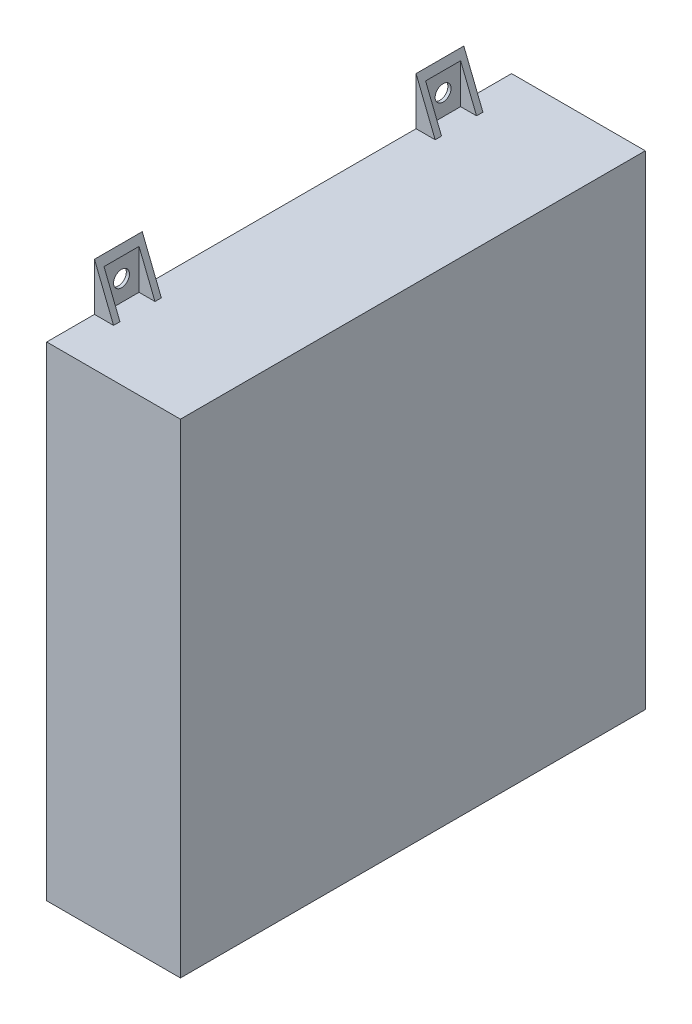
ISO-10303-21;
HEADER;
FILE_DESCRIPTION(('STEP AP214'),'2;1');
FILE_NAME('part.step','',(''),(''),'','','');
FILE_SCHEMA(('AUTOMOTIVE_DESIGN { 1 0 10303 214 1 1 1 1 }'));
ENDSEC;
DATA;
#1=APPLICATION_CONTEXT('core data for automotive mechanical design processes');
#2=APPLICATION_PROTOCOL_DEFINITION('international standard','automotive_design',2000,#1);
#3=PRODUCT_CONTEXT('',#1,'mechanical');
#4=PRODUCT('Part','Part','',(#3));
#5=PRODUCT_RELATED_PRODUCT_CATEGORY('part','',(#4));
#6=PRODUCT_DEFINITION_FORMATION('','',#4);
#7=PRODUCT_DEFINITION_CONTEXT('part definition',#1,'design');
#8=PRODUCT_DEFINITION('design','',#6,#7);
#9=PRODUCT_DEFINITION_SHAPE('','',#8);
#10=(LENGTH_UNIT() NAMED_UNIT(*) SI_UNIT(.MILLI.,.METRE.));
#11=(NAMED_UNIT(*) PLANE_ANGLE_UNIT() SI_UNIT($,.RADIAN.));
#12=(NAMED_UNIT(*) SI_UNIT($,.STERADIAN.) SOLID_ANGLE_UNIT());
#13=UNCERTAINTY_MEASURE_WITH_UNIT(LENGTH_MEASURE(1.E-05),#10,'distance_accuracy_value','');
#14=(GEOMETRIC_REPRESENTATION_CONTEXT(3) GLOBAL_UNCERTAINTY_ASSIGNED_CONTEXT((#13)) GLOBAL_UNIT_ASSIGNED_CONTEXT((#10,
#11,#12)) REPRESENTATION_CONTEXT('',''));
#15=CARTESIAN_POINT('',(0.,0.,0.));
#16=DIRECTION('',(0.,0.,1.));
#17=DIRECTION('',(1.,0.,0.));
#18=AXIS2_PLACEMENT_3D('',#15,#16,#17);
#19=CARTESIAN_POINT('',(0.,91.,43.));
#20=DIRECTION('',(-0.928476690885259,-0.371390676354104,0.));
#21=DIRECTION('',(0.371390676354104,-0.92847669088526,0.));
#22=AXIS2_PLACEMENT_3D('',#19,#20,#21);
#23=PLANE('',#22);
#24=DIRECTION('',(0.371390676354103,-0.928476690885259,0.));
#25=VECTOR('',#24,1.);
#26=CARTESIAN_POINT('',(6.,76.,45.));
#27=LINE('',#26,#25);
#28=CARTESIAN_POINT('',(1.,88.5,45.));
#29=VERTEX_POINT('',#28);
#30=CARTESIAN_POINT('',(6.,76.,45.));
#31=VERTEX_POINT('',#30);
#32=EDGE_CURVE('E225',#29,#31,#27,.T.);
#33=ORIENTED_EDGE('',*,*,#32,.T.);
#34=DIRECTION('',(0.,0.,1.));
#35=VECTOR('',#34,1.);
#36=CARTESIAN_POINT('',(6.,76.,43.));
#37=LINE('',#36,#35);
#38=CARTESIAN_POINT('',(6.,76.,43.));
#39=VERTEX_POINT('',#38);
#40=EDGE_CURVE('E236',#39,#31,#37,.T.);
#41=ORIENTED_EDGE('',*,*,#40,.F.);
#42=DIRECTION('',(0.371390676354104,-0.928476690885259,0.));
#43=VECTOR('',#42,1.);
#44=CARTESIAN_POINT('',(0.,91.,43.));
#45=LINE('',#44,#43);
#46=CARTESIAN_POINT('',(0.,91.,43.));
#47=VERTEX_POINT('',#46);
#48=EDGE_CURVE('E406',#47,#39,#45,.T.);
#49=ORIENTED_EDGE('',*,*,#48,.F.);
#50=DIRECTION('',(0.,0.,1.));
#51=VECTOR('',#50,1.);
#52=CARTESIAN_POINT('',(0.,91.,43.));
#53=LINE('',#52,#51);
#54=CARTESIAN_POINT('',(0.,91.,58.));
#55=VERTEX_POINT('',#54);
#56=EDGE_CURVE('E244',#47,#55,#53,.T.);
#57=ORIENTED_EDGE('',*,*,#56,.T.);
#58=DIRECTION('',(0.371390676354104,-0.928476690885259,0.));
#59=VECTOR('',#58,1.);
#60=CARTESIAN_POINT('',(0.,91.,58.));
#61=LINE('',#60,#59);
#62=CARTESIAN_POINT('',(6.,76.,58.));
#63=VERTEX_POINT('',#62);
#64=EDGE_CURVE('E412',#55,#63,#61,.T.);
#65=ORIENTED_EDGE('',*,*,#64,.T.);
#66=CARTESIAN_POINT('',(6.,76.,56.));
#67=VERTEX_POINT('',#66);
#68=EDGE_CURVE('E245',#67,#63,#37,.T.);
#69=ORIENTED_EDGE('',*,*,#68,.F.);
#70=DIRECTION('',(0.371390676354103,-0.928476690885259,0.));
#71=VECTOR('',#70,1.);
#72=CARTESIAN_POINT('',(6.,76.,56.));
#73=LINE('',#72,#71);
#74=CARTESIAN_POINT('',(0.999999999999996,88.5,56.));
#75=VERTEX_POINT('',#74);
#76=EDGE_CURVE('E424',#75,#67,#73,.T.);
#77=ORIENTED_EDGE('',*,*,#76,.F.);
#78=DIRECTION('',(0.,0.,1.));
#79=VECTOR('',#78,1.);
#80=CARTESIAN_POINT('',(1.,88.5,45.));
#81=LINE('',#80,#79);
#82=EDGE_CURVE('E50',#29,#75,#81,.T.);
#83=ORIENTED_EDGE('',*,*,#82,.F.);
#84=EDGE_LOOP('',(#33,#41,#49,#57,#65,#69,#77,#83));
#85=FACE_BOUND('',#84,.T.);
#86=ADVANCED_FACE('F35',(#85),#23,.F.);
#87=CARTESIAN_POINT('',(0.,91.,-43.));
#88=DIRECTION('',(0.928476690885259,0.371390676354104,0.));
#89=DIRECTION('',(-0.371390676354104,0.92847669088526,0.));
#90=AXIS2_PLACEMENT_3D('',#87,#88,#89);
#91=PLANE('',#90);
#92=DIRECTION('',(0.,0.,-1.));
#93=VECTOR('',#92,1.);
#94=CARTESIAN_POINT('',(6.,76.,-43.));
#95=LINE('',#94,#93);
#96=CARTESIAN_POINT('',(6.,76.,-43.));
#97=VERTEX_POINT('',#96);
#98=CARTESIAN_POINT('',(6.,76.,-45.));
#99=VERTEX_POINT('',#98);
#100=EDGE_CURVE('E399',#97,#99,#95,.T.);
#101=ORIENTED_EDGE('',*,*,#100,.T.);
#102=DIRECTION('',(0.371390676354103,-0.928476690885259,0.));
#103=VECTOR('',#102,1.);
#104=CARTESIAN_POINT('',(6.,76.,-45.));
#105=LINE('',#104,#103);
#106=CARTESIAN_POINT('',(1.,88.5,-45.));
#107=VERTEX_POINT('',#106);
#108=EDGE_CURVE('E442',#107,#99,#105,.T.);
#109=ORIENTED_EDGE('',*,*,#108,.F.);
#110=DIRECTION('',(0.,0.,-1.));
#111=VECTOR('',#110,1.);
#112=CARTESIAN_POINT('',(1.,88.5,-45.));
#113=LINE('',#112,#111);
#114=CARTESIAN_POINT('',(1.,88.5,-56.));
#115=VERTEX_POINT('',#114);
#116=EDGE_CURVE('E450',#107,#115,#113,.T.);
#117=ORIENTED_EDGE('',*,*,#116,.T.);
#118=DIRECTION('',(0.371390676354103,-0.928476690885259,0.));
#119=VECTOR('',#118,1.);
#120=CARTESIAN_POINT('',(6.,76.,-56.));
#121=LINE('',#120,#119);
#122=CARTESIAN_POINT('',(6.,76.,-56.));
#123=VERTEX_POINT('',#122);
#124=EDGE_CURVE('E439',#115,#123,#121,.T.);
#125=ORIENTED_EDGE('',*,*,#124,.T.);
#126=CARTESIAN_POINT('',(6.,76.,-58.));
#127=VERTEX_POINT('',#126);
#128=EDGE_CURVE('E403',#123,#127,#95,.T.);
#129=ORIENTED_EDGE('',*,*,#128,.T.);
#130=DIRECTION('',(0.371390676354104,-0.928476690885259,0.));
#131=VECTOR('',#130,1.);
#132=CARTESIAN_POINT('',(0.,91.,-58.));
#133=LINE('',#132,#131);
#134=CARTESIAN_POINT('',(0.,91.,-58.));
#135=VERTEX_POINT('',#134);
#136=EDGE_CURVE('E389',#135,#127,#133,.T.);
#137=ORIENTED_EDGE('',*,*,#136,.F.);
#138=DIRECTION('',(0.,0.,-1.));
#139=VECTOR('',#138,1.);
#140=CARTESIAN_POINT('',(0.,91.,-43.));
#141=LINE('',#140,#139);
#142=CARTESIAN_POINT('',(0.,91.,-43.));
#143=VERTEX_POINT('',#142);
#144=EDGE_CURVE('E395',#143,#135,#141,.T.);
#145=ORIENTED_EDGE('',*,*,#144,.F.);
#146=DIRECTION('',(0.371390676354104,-0.928476690885259,0.));
#147=VECTOR('',#146,1.);
#148=CARTESIAN_POINT('',(0.,91.,-43.));
#149=LINE('',#148,#147);
#150=EDGE_CURVE('E392',#143,#97,#149,.T.);
#151=ORIENTED_EDGE('',*,*,#150,.T.);
#152=EDGE_LOOP('',(#101,#109,#117,#125,#129,#137,#145,#151));
#153=FACE_BOUND('',#152,.T.);
#154=ADVANCED_FACE('F500',(#153),#91,.T.);
#155=CARTESIAN_POINT('',(0.,-91.,-43.));
#156=DIRECTION('',(-0.928476690885259,0.371390676354104,0.));
#157=DIRECTION('',(-0.371390676354104,-0.92847669088526,0.));
#158=AXIS2_PLACEMENT_3D('',#155,#156,#157);
#159=PLANE('',#158);
#160=DIRECTION('',(0.371390676354103,0.928476690885259,0.));
#161=VECTOR('',#160,1.);
#162=CARTESIAN_POINT('',(6.,-76.,-45.));
#163=LINE('',#162,#161);
#164=CARTESIAN_POINT('',(1.,-88.5,-45.));
#165=VERTEX_POINT('',#164);
#166=CARTESIAN_POINT('',(6.,-76.,-45.));
#167=VERTEX_POINT('',#166);
#168=EDGE_CURVE('E458',#165,#167,#163,.T.);
#169=ORIENTED_EDGE('',*,*,#168,.T.);
#170=DIRECTION('',(0.,0.,-1.));
#171=VECTOR('',#170,1.);
#172=CARTESIAN_POINT('',(6.,-76.,-43.));
#173=LINE('',#172,#171);
#174=CARTESIAN_POINT('',(6.,-76.,-43.));
#175=VERTEX_POINT('',#174);
#176=EDGE_CURVE('E383',#175,#167,#173,.T.);
#177=ORIENTED_EDGE('',*,*,#176,.F.);
#178=DIRECTION('',(0.371390676354104,0.928476690885259,0.));
#179=VECTOR('',#178,1.);
#180=CARTESIAN_POINT('',(0.,-91.,-43.));
#181=LINE('',#180,#179);
#182=CARTESIAN_POINT('',(0.,-91.,-43.));
#183=VERTEX_POINT('',#182);
#184=EDGE_CURVE('E368',#183,#175,#181,.T.);
#185=ORIENTED_EDGE('',*,*,#184,.F.);
#186=DIRECTION('',(0.,0.,-1.));
#187=VECTOR('',#186,1.);
#188=CARTESIAN_POINT('',(0.,-91.,-43.));
#189=LINE('',#188,#187);
#190=CARTESIAN_POINT('',(0.,-91.,-58.));
#191=VERTEX_POINT('',#190);
#192=EDGE_CURVE('E380',#183,#191,#189,.T.);
#193=ORIENTED_EDGE('',*,*,#192,.T.);
#194=DIRECTION('',(0.371390676354104,0.928476690885259,0.));
#195=VECTOR('',#194,1.);
#196=CARTESIAN_POINT('',(0.,-91.,-58.));
#197=LINE('',#196,#195);
#198=CARTESIAN_POINT('',(6.,-76.,-58.));
#199=VERTEX_POINT('',#198);
#200=EDGE_CURVE('E376',#191,#199,#197,.T.);
#201=ORIENTED_EDGE('',*,*,#200,.T.);
#202=CARTESIAN_POINT('',(6.,-76.,-56.));
#203=VERTEX_POINT('',#202);
#204=EDGE_CURVE('E374',#203,#199,#173,.T.);
#205=ORIENTED_EDGE('',*,*,#204,.F.);
#206=DIRECTION('',(0.371390676354103,0.928476690885259,0.));
#207=VECTOR('',#206,1.);
#208=CARTESIAN_POINT('',(6.,-76.,-56.));
#209=LINE('',#208,#207);
#210=CARTESIAN_POINT('',(0.999999999999996,-88.5,-56.));
#211=VERTEX_POINT('',#210);
#212=EDGE_CURVE('E467',#211,#203,#209,.T.);
#213=ORIENTED_EDGE('',*,*,#212,.F.);
#214=DIRECTION('',(0.,0.,-1.));
#215=VECTOR('',#214,1.);
#216=CARTESIAN_POINT('',(1.,-88.5,-45.));
#217=LINE('',#216,#215);
#218=EDGE_CURVE('E464',#165,#211,#217,.T.);
#219=ORIENTED_EDGE('',*,*,#218,.F.);
#220=EDGE_LOOP('',(#169,#177,#185,#193,#201,#205,#213,#219));
#221=FACE_BOUND('',#220,.T.);
#222=ADVANCED_FACE('F505',(#221),#159,.F.);
#223=CARTESIAN_POINT('',(0.,-91.,43.));
#224=DIRECTION('',(0.928476690885259,-0.371390676354104,0.));
#225=DIRECTION('',(0.371390676354104,0.92847669088526,0.));
#226=AXIS2_PLACEMENT_3D('',#223,#224,#225);
#227=PLANE('',#226);
#228=DIRECTION('',(0.,0.,1.));
#229=VECTOR('',#228,1.);
#230=CARTESIAN_POINT('',(6.,-76.,43.));
#231=LINE('',#230,#229);
#232=CARTESIAN_POINT('',(6.,-76.,43.));
#233=VERTEX_POINT('',#232);
#234=CARTESIAN_POINT('',(6.,-76.,45.));
#235=VERTEX_POINT('',#234);
#236=EDGE_CURVE('E271',#233,#235,#231,.T.);
#237=ORIENTED_EDGE('',*,*,#236,.T.);
#238=DIRECTION('',(0.371390676354103,0.928476690885259,0.));
#239=VECTOR('',#238,1.);
#240=CARTESIAN_POINT('',(6.,-76.,45.));
#241=LINE('',#240,#239);
#242=CARTESIAN_POINT('',(1.,-88.5,45.));
#243=VERTEX_POINT('',#242);
#244=EDGE_CURVE('E364',#243,#235,#241,.T.);
#245=ORIENTED_EDGE('',*,*,#244,.F.);
#246=DIRECTION('',(0.,0.,1.));
#247=VECTOR('',#246,1.);
#248=CARTESIAN_POINT('',(1.,-88.5,45.));
#249=LINE('',#248,#247);
#250=CARTESIAN_POINT('',(1.,-88.5,56.));
#251=VERTEX_POINT('',#250);
#252=EDGE_CURVE('E348',#243,#251,#249,.T.);
#253=ORIENTED_EDGE('',*,*,#252,.T.);
#254=DIRECTION('',(0.371390676354103,0.928476690885259,0.));
#255=VECTOR('',#254,1.);
#256=CARTESIAN_POINT('',(6.,-76.,56.));
#257=LINE('',#256,#255);
#258=CARTESIAN_POINT('',(6.,-76.,56.));
#259=VERTEX_POINT('',#258);
#260=EDGE_CURVE('E346',#251,#259,#257,.T.);
#261=ORIENTED_EDGE('',*,*,#260,.T.);
#262=CARTESIAN_POINT('',(6.,-76.,58.));
#263=VERTEX_POINT('',#262);
#264=EDGE_CURVE('E275',#259,#263,#231,.T.);
#265=ORIENTED_EDGE('',*,*,#264,.T.);
#266=DIRECTION('',(0.371390676354104,0.928476690885259,0.));
#267=VECTOR('',#266,1.);
#268=CARTESIAN_POINT('',(0.,-91.,58.));
#269=LINE('',#268,#267);
#270=CARTESIAN_POINT('',(0.,-91.,58.));
#271=VERTEX_POINT('',#270);
#272=EDGE_CURVE('E257',#271,#263,#269,.T.);
#273=ORIENTED_EDGE('',*,*,#272,.F.);
#274=DIRECTION('',(0.,0.,1.));
#275=VECTOR('',#274,1.);
#276=CARTESIAN_POINT('',(0.,-91.,43.));
#277=LINE('',#276,#275);
#278=CARTESIAN_POINT('',(0.,-91.,43.));
#279=VERTEX_POINT('',#278);
#280=EDGE_CURVE('E263',#279,#271,#277,.T.);
#281=ORIENTED_EDGE('',*,*,#280,.F.);
#282=DIRECTION('',(0.371390676354104,0.928476690885259,0.));
#283=VECTOR('',#282,1.);
#284=CARTESIAN_POINT('',(0.,-91.,43.));
#285=LINE('',#284,#283);
#286=EDGE_CURVE('E260',#279,#233,#285,.T.);
#287=ORIENTED_EDGE('',*,*,#286,.T.);
#288=EDGE_LOOP('',(#237,#245,#253,#261,#265,#273,#281,#287));
#289=FACE_BOUND('',#288,.T.);
#290=ADVANCED_FACE('F343',(#289),#227,.T.);
#291=CARTESIAN_POINT('',(42.,-76.,73.));
#292=DIRECTION('',(0.,1.,0.));
#293=DIRECTION('',(0.,0.,1.));
#294=AXIS2_PLACEMENT_3D('',#291,#292,#293);
#295=PLANE('',#294);
#296=DIRECTION('',(-1.,0.,0.));
#297=VECTOR('',#296,1.);
#298=CARTESIAN_POINT('',(6.,-76.,-43.));
#299=LINE('',#298,#297);
#300=CARTESIAN_POINT('',(0.,-76.,-43.));
#301=VERTEX_POINT('',#300);
#302=EDGE_CURVE('E365',#175,#301,#299,.T.);
#303=ORIENTED_EDGE('',*,*,#302,.F.);
#304=ORIENTED_EDGE('',*,*,#176,.T.);
#305=DIRECTION('',(-1.,0.,0.));
#306=VECTOR('',#305,1.);
#307=CARTESIAN_POINT('',(1.,-76.,-45.));
#308=LINE('',#307,#306);
#309=CARTESIAN_POINT('',(1.,-76.,-45.));
#310=VERTEX_POINT('',#309);
#311=EDGE_CURVE('E455',#167,#310,#308,.T.);
#312=ORIENTED_EDGE('',*,*,#311,.T.);
#313=DIRECTION('',(0.,0.,-1.));
#314=VECTOR('',#313,1.);
#315=CARTESIAN_POINT('',(1.,-76.,-45.));
#316=LINE('',#315,#314);
#317=CARTESIAN_POINT('',(1.,-76.,-56.));
#318=VERTEX_POINT('',#317);
#319=EDGE_CURVE('E471',#310,#318,#316,.T.);
#320=ORIENTED_EDGE('',*,*,#319,.T.);
#321=DIRECTION('',(-1.,0.,0.));
#322=VECTOR('',#321,1.);
#323=CARTESIAN_POINT('',(1.,-76.,-56.));
#324=LINE('',#323,#322);
#325=EDGE_CURVE('E453',#203,#318,#324,.T.);
#326=ORIENTED_EDGE('',*,*,#325,.F.);
#327=ORIENTED_EDGE('',*,*,#204,.T.);
#328=DIRECTION('',(-1.,0.,0.));
#329=VECTOR('',#328,1.);
#330=CARTESIAN_POINT('',(6.,-76.,-58.));
#331=LINE('',#330,#329);
#332=CARTESIAN_POINT('',(0.,-76.,-58.));
#333=VERTEX_POINT('',#332);
#334=EDGE_CURVE('E361',#199,#333,#331,.T.);
#335=ORIENTED_EDGE('',*,*,#334,.T.);
#336=DIRECTION('',(0.,0.,-1.));
#337=VECTOR('',#336,1.);
#338=CARTESIAN_POINT('',(0.,-76.,73.));
#339=LINE('',#338,#337);
#340=CARTESIAN_POINT('',(0.,-76.,-73.));
#341=VERTEX_POINT('',#340);
#342=EDGE_CURVE('E290',#333,#341,#339,.T.);
#343=ORIENTED_EDGE('',*,*,#342,.T.);
#344=DIRECTION('',(-1.,0.,0.));
#345=VECTOR('',#344,1.);
#346=CARTESIAN_POINT('',(42.,-76.,-73.));
#347=LINE('',#346,#345);
#348=CARTESIAN_POINT('',(42.,-76.,-73.));
#349=VERTEX_POINT('',#348);
#350=EDGE_CURVE('E43',#349,#341,#347,.T.);
#351=ORIENTED_EDGE('',*,*,#350,.F.);
#352=DIRECTION('',(0.,0.,-1.));
#353=VECTOR('',#352,1.);
#354=CARTESIAN_POINT('',(42.,-76.,73.));
#355=LINE('',#354,#353);
#356=CARTESIAN_POINT('',(42.,-76.,73.));
#357=VERTEX_POINT('',#356);
#358=EDGE_CURVE('E280',#357,#349,#355,.T.);
#359=ORIENTED_EDGE('',*,*,#358,.F.);
#360=DIRECTION('',(-1.,0.,0.));
#361=VECTOR('',#360,1.);
#362=CARTESIAN_POINT('',(42.,-76.,73.));
#363=LINE('',#362,#361);
#364=CARTESIAN_POINT('',(0.,-76.,73.));
#365=VERTEX_POINT('',#364);
#366=EDGE_CURVE('E11',#357,#365,#363,.T.);
#367=ORIENTED_EDGE('',*,*,#366,.T.);
#368=CARTESIAN_POINT('',(0.,-76.,58.));
#369=VERTEX_POINT('',#368);
#370=EDGE_CURVE('E291',#365,#369,#339,.T.);
#371=ORIENTED_EDGE('',*,*,#370,.T.);
#372=DIRECTION('',(-1.,0.,0.));
#373=VECTOR('',#372,1.);
#374=CARTESIAN_POINT('',(6.,-76.,58.));
#375=LINE('',#374,#373);
#376=EDGE_CURVE('E248',#263,#369,#375,.T.);
#377=ORIENTED_EDGE('',*,*,#376,.F.);
#378=ORIENTED_EDGE('',*,*,#264,.F.);
#379=DIRECTION('',(-1.,0.,0.));
#380=VECTOR('',#379,1.);
#381=CARTESIAN_POINT('',(1.,-76.,56.));
#382=LINE('',#381,#380);
#383=CARTESIAN_POINT('',(1.,-76.,56.));
#384=VERTEX_POINT('',#383);
#385=EDGE_CURVE('E340',#259,#384,#382,.T.);
#386=ORIENTED_EDGE('',*,*,#385,.T.);
#387=DIRECTION('',(0.,0.,1.));
#388=VECTOR('',#387,1.);
#389=CARTESIAN_POINT('',(1.,-76.,45.));
#390=LINE('',#389,#388);
#391=CARTESIAN_POINT('',(1.,-76.,45.));
#392=VERTEX_POINT('',#391);
#393=EDGE_CURVE('E362',#392,#384,#390,.T.);
#394=ORIENTED_EDGE('',*,*,#393,.F.);
#395=DIRECTION('',(-1.,0.,0.));
#396=VECTOR('',#395,1.);
#397=CARTESIAN_POINT('',(1.,-76.,45.));
#398=LINE('',#397,#396);
#399=EDGE_CURVE('E351',#235,#392,#398,.T.);
#400=ORIENTED_EDGE('',*,*,#399,.F.);
#401=ORIENTED_EDGE('',*,*,#236,.F.);
#402=DIRECTION('',(-1.,0.,0.));
#403=VECTOR('',#402,1.);
#404=CARTESIAN_POINT('',(6.,-76.,43.));
#405=LINE('',#404,#403);
#406=CARTESIAN_POINT('',(0.,-76.,43.));
#407=VERTEX_POINT('',#406);
#408=EDGE_CURVE('E253',#233,#407,#405,.T.);
#409=ORIENTED_EDGE('',*,*,#408,.T.);
#410=EDGE_CURVE('E295',#407,#301,#339,.T.);
#411=ORIENTED_EDGE('',*,*,#410,.T.);
#412=EDGE_LOOP('',(#303,#304,#312,#320,#326,#327,#335,#343,#351,#359,#367,#371,#377,#378,#386,
#394,#400,#401,#409,#411));
#413=FACE_BOUND('',#412,.T.);
#414=ADVANCED_FACE('F331',(#413),#295,.F.);
#415=CARTESIAN_POINT('',(42.,76.,73.));
#416=DIRECTION('',(0.,-1.,0.));
#417=DIRECTION('',(0.,0.,-1.));
#418=AXIS2_PLACEMENT_3D('',#415,#416,#417);
#419=PLANE('',#418);
#420=DIRECTION('',(-1.,0.,0.));
#421=VECTOR('',#420,1.);
#422=CARTESIAN_POINT('',(6.,76.,-43.));
#423=LINE('',#422,#421);
#424=CARTESIAN_POINT('',(0.,76.,-43.));
#425=VERTEX_POINT('',#424);
#426=EDGE_CURVE('E386',#97,#425,#423,.T.);
#427=ORIENTED_EDGE('',*,*,#426,.T.);
#428=DIRECTION('',(0.,0.,1.));
#429=VECTOR('',#428,1.);
#430=CARTESIAN_POINT('',(0.,76.,73.));
#431=LINE('',#430,#429);
#432=CARTESIAN_POINT('',(0.,76.,43.));
#433=VERTEX_POINT('',#432);
#434=EDGE_CURVE('E299',#425,#433,#431,.T.);
#435=ORIENTED_EDGE('',*,*,#434,.T.);
#436=DIRECTION('',(-1.,0.,0.));
#437=VECTOR('',#436,1.);
#438=CARTESIAN_POINT('',(6.,76.,43.));
#439=LINE('',#438,#437);
#440=EDGE_CURVE('E243',#39,#433,#439,.T.);
#441=ORIENTED_EDGE('',*,*,#440,.F.);
#442=ORIENTED_EDGE('',*,*,#40,.T.);
#443=DIRECTION('',(-1.,0.,0.));
#444=VECTOR('',#443,1.);
#445=CARTESIAN_POINT('',(1.,76.,45.));
#446=LINE('',#445,#444);
#447=CARTESIAN_POINT('',(1.,76.,45.));
#448=VERTEX_POINT('',#447);
#449=EDGE_CURVE('E222',#31,#448,#446,.T.);
#450=ORIENTED_EDGE('',*,*,#449,.T.);
#451=DIRECTION('',(0.,0.,1.));
#452=VECTOR('',#451,1.);
#453=CARTESIAN_POINT('',(1.,76.,45.));
#454=LINE('',#453,#452);
#455=CARTESIAN_POINT('',(1.,76.,56.));
#456=VERTEX_POINT('',#455);
#457=EDGE_CURVE('E432',#448,#456,#454,.T.);
#458=ORIENTED_EDGE('',*,*,#457,.T.);
#459=DIRECTION('',(-1.,0.,0.));
#460=VECTOR('',#459,1.);
#461=CARTESIAN_POINT('',(1.,76.,56.));
#462=LINE('',#461,#460);
#463=EDGE_CURVE('E423',#67,#456,#462,.T.);
#464=ORIENTED_EDGE('',*,*,#463,.F.);
#465=ORIENTED_EDGE('',*,*,#68,.T.);
#466=DIRECTION('',(-1.,0.,0.));
#467=VECTOR('',#466,1.);
#468=CARTESIAN_POINT('',(6.,76.,58.));
#469=LINE('',#468,#467);
#470=CARTESIAN_POINT('',(0.,76.,58.));
#471=VERTEX_POINT('',#470);
#472=EDGE_CURVE('E402',#63,#471,#469,.T.);
#473=ORIENTED_EDGE('',*,*,#472,.T.);
#474=CARTESIAN_POINT('',(0.,76.,73.));
#475=VERTEX_POINT('',#474);
#476=EDGE_CURVE('E297',#471,#475,#431,.T.);
#477=ORIENTED_EDGE('',*,*,#476,.T.);
#478=DIRECTION('',(-1.,0.,0.));
#479=VECTOR('',#478,1.);
#480=CARTESIAN_POINT('',(42.,76.,73.));
#481=LINE('',#480,#479);
#482=CARTESIAN_POINT('',(42.,76.,73.));
#483=VERTEX_POINT('',#482);
#484=EDGE_CURVE('E287',#483,#475,#481,.T.);
#485=ORIENTED_EDGE('',*,*,#484,.F.);
#486=DIRECTION('',(0.,0.,1.));
#487=VECTOR('',#486,1.);
#488=CARTESIAN_POINT('',(42.,76.,73.));
#489=LINE('',#488,#487);
#490=CARTESIAN_POINT('',(42.,76.,-73.));
#491=VERTEX_POINT('',#490);
#492=EDGE_CURVE('E285',#491,#483,#489,.T.);
#493=ORIENTED_EDGE('',*,*,#492,.F.);
#494=DIRECTION('',(-1.,0.,0.));
#495=VECTOR('',#494,1.);
#496=CARTESIAN_POINT('',(42.,76.,-73.));
#497=LINE('',#496,#495);
#498=CARTESIAN_POINT('',(0.,76.,-73.));
#499=VERTEX_POINT('',#498);
#500=EDGE_CURVE('E302',#491,#499,#497,.T.);
#501=ORIENTED_EDGE('',*,*,#500,.T.);
#502=CARTESIAN_POINT('',(0.,76.,-58.));
#503=VERTEX_POINT('',#502);
#504=EDGE_CURVE('E281',#499,#503,#431,.T.);
#505=ORIENTED_EDGE('',*,*,#504,.T.);
#506=DIRECTION('',(-1.,0.,0.));
#507=VECTOR('',#506,1.);
#508=CARTESIAN_POINT('',(6.,76.,-58.));
#509=LINE('',#508,#507);
#510=EDGE_CURVE('E323',#127,#503,#509,.T.);
#511=ORIENTED_EDGE('',*,*,#510,.F.);
#512=ORIENTED_EDGE('',*,*,#128,.F.);
#513=DIRECTION('',(-1.,0.,0.));
#514=VECTOR('',#513,1.);
#515=CARTESIAN_POINT('',(1.,76.,-56.));
#516=LINE('',#515,#514);
#517=CARTESIAN_POINT('',(1.,76.,-56.));
#518=VERTEX_POINT('',#517);
#519=EDGE_CURVE('E58',#123,#518,#516,.T.);
#520=ORIENTED_EDGE('',*,*,#519,.T.);
#521=DIRECTION('',(0.,0.,-1.));
#522=VECTOR('',#521,1.);
#523=CARTESIAN_POINT('',(1.,76.,-45.));
#524=LINE('',#523,#522);
#525=CARTESIAN_POINT('',(1.,76.,-45.));
#526=VERTEX_POINT('',#525);
#527=EDGE_CURVE('E445',#526,#518,#524,.T.);
#528=ORIENTED_EDGE('',*,*,#527,.F.);
#529=DIRECTION('',(-1.,0.,0.));
#530=VECTOR('',#529,1.);
#531=CARTESIAN_POINT('',(1.,76.,-45.));
#532=LINE('',#531,#530);
#533=EDGE_CURVE('E435',#99,#526,#532,.T.);
#534=ORIENTED_EDGE('',*,*,#533,.F.);
#535=ORIENTED_EDGE('',*,*,#100,.F.);
#536=EDGE_LOOP('',(#427,#435,#441,#442,#450,#458,#464,#465,#473,#477,#485,#493,#501,#505,#511,
#512,#520,#528,#534,#535));
#537=FACE_BOUND('',#536,.T.);
#538=ADVANCED_FACE('F241',(#537),#419,.F.);
#539=CARTESIAN_POINT('',(42.,76.,73.));
#540=DIRECTION('',(0.,0.,-1.));
#541=DIRECTION('',(0.,1.,0.));
#542=AXIS2_PLACEMENT_3D('',#539,#540,#541);
#543=PLANE('',#542);
#544=DIRECTION('',(0.,-1.,0.));
#545=VECTOR('',#544,1.);
#546=CARTESIAN_POINT('',(0.,76.,73.));
#547=LINE('',#546,#545);
#548=EDGE_CURVE('E274',#475,#365,#547,.T.);
#549=ORIENTED_EDGE('',*,*,#548,.T.);
#550=ORIENTED_EDGE('',*,*,#366,.F.);
#551=DIRECTION('',(0.,-1.,0.));
#552=VECTOR('',#551,1.);
#553=CARTESIAN_POINT('',(42.,76.,73.));
#554=LINE('',#553,#552);
#555=EDGE_CURVE('E277',#483,#357,#554,.T.);
#556=ORIENTED_EDGE('',*,*,#555,.F.);
#557=ORIENTED_EDGE('',*,*,#484,.T.);
#558=EDGE_LOOP('',(#549,#550,#556,#557));
#559=FACE_BOUND('',#558,.T.);
#560=ADVANCED_FACE('F37',(#559),#543,.F.);
#561=CARTESIAN_POINT('',(42.,76.,-73.));
#562=DIRECTION('',(0.,0.,1.));
#563=DIRECTION('',(1.,0.,0.));
#564=AXIS2_PLACEMENT_3D('',#561,#562,#563);
#565=PLANE('',#564);
#566=DIRECTION('',(0.,1.,0.));
#567=VECTOR('',#566,1.);
#568=CARTESIAN_POINT('',(0.,76.,-73.));
#569=LINE('',#568,#567);
#570=EDGE_CURVE('E294',#341,#499,#569,.T.);
#571=ORIENTED_EDGE('',*,*,#570,.T.);
#572=ORIENTED_EDGE('',*,*,#500,.F.);
#573=DIRECTION('',(0.,1.,0.));
#574=VECTOR('',#573,1.);
#575=CARTESIAN_POINT('',(42.,76.,-73.));
#576=LINE('',#575,#574);
#577=EDGE_CURVE('E283',#349,#491,#576,.T.);
#578=ORIENTED_EDGE('',*,*,#577,.F.);
#579=ORIENTED_EDGE('',*,*,#350,.T.);
#580=EDGE_LOOP('',(#571,#572,#578,#579));
#581=FACE_BOUND('',#580,.T.);
#582=ADVANCED_FACE('F309',(#581),#565,.F.);
#583=CARTESIAN_POINT('',(42.,0.,0.));
#584=DIRECTION('',(1.,0.,0.));
#585=DIRECTION('',(0.,0.,-1.));
#586=AXIS2_PLACEMENT_3D('',#583,#584,#585);
#587=PLANE('',#586);
#588=ORIENTED_EDGE('',*,*,#555,.T.);
#589=ORIENTED_EDGE('',*,*,#358,.T.);
#590=ORIENTED_EDGE('',*,*,#577,.T.);
#591=ORIENTED_EDGE('',*,*,#492,.T.);
#592=EDGE_LOOP('',(#588,#589,#590,#591));
#593=FACE_BOUND('',#592,.T.);
#594=ADVANCED_FACE('F329',(#593),#587,.T.);
#595=CARTESIAN_POINT('',(0.,0.,0.));
#596=DIRECTION('',(1.,0.,0.));
#597=DIRECTION('',(0.,0.,-1.));
#598=AXIS2_PLACEMENT_3D('',#595,#596,#597);
#599=PLANE('',#598);
#600=CARTESIAN_POINT('',(0.,-82.5,-50.5));
#601=DIRECTION('',(1.,0.,0.));
#602=DIRECTION('',(0.,0.,-1.));
#603=AXIS2_PLACEMENT_3D('',#600,#601,#602);
#604=CIRCLE('',#603,2.5);
#605=CARTESIAN_POINT('',(0.,-82.5,-53.));
#606=VERTEX_POINT('',#605);
#607=EDGE_CURVE('E778',#606,#606,#604,.T.);
#608=ORIENTED_EDGE('',*,*,#607,.T.);
#609=EDGE_LOOP('',(#608));
#610=FACE_BOUND('',#609,.T.);
#611=CARTESIAN_POINT('',(0.,82.5,50.5));
#612=DIRECTION('',(1.,0.,0.));
#613=DIRECTION('',(0.,0.,-1.));
#614=AXIS2_PLACEMENT_3D('',#611,#612,#613);
#615=CIRCLE('',#614,2.5);
#616=CARTESIAN_POINT('',(0.,82.5,48.));
#617=VERTEX_POINT('',#616);
#618=EDGE_CURVE('E784',#617,#617,#615,.T.);
#619=ORIENTED_EDGE('',*,*,#618,.T.);
#620=EDGE_LOOP('',(#619));
#621=FACE_BOUND('',#620,.T.);
#622=CARTESIAN_POINT('',(0.,82.5,-50.5));
#623=DIRECTION('',(1.,0.,0.));
#624=DIRECTION('',(0.,0.,-1.));
#625=AXIS2_PLACEMENT_3D('',#622,#623,#624);
#626=CIRCLE('',#625,2.5);
#627=CARTESIAN_POINT('',(0.,82.5,-53.));
#628=VERTEX_POINT('',#627);
#629=EDGE_CURVE('E781',#628,#628,#626,.T.);
#630=ORIENTED_EDGE('',*,*,#629,.T.);
#631=EDGE_LOOP('',(#630));
#632=FACE_BOUND('',#631,.T.);
#633=CARTESIAN_POINT('',(0.,-82.5,50.5));
#634=DIRECTION('',(1.,0.,0.));
#635=DIRECTION('',(0.,0.,-1.));
#636=AXIS2_PLACEMENT_3D('',#633,#634,#635);
#637=CIRCLE('',#636,2.5);
#638=CARTESIAN_POINT('',(0.,-82.5,48.));
#639=VERTEX_POINT('',#638);
#640=EDGE_CURVE('E428',#639,#639,#637,.T.);
#641=ORIENTED_EDGE('',*,*,#640,.T.);
#642=EDGE_LOOP('',(#641));
#643=FACE_BOUND('',#642,.T.);
#644=ORIENTED_EDGE('',*,*,#548,.F.);
#645=ORIENTED_EDGE('',*,*,#476,.F.);
#646=DIRECTION('',(0.,1.,0.));
#647=VECTOR('',#646,1.);
#648=CARTESIAN_POINT('',(0.,76.,58.));
#649=LINE('',#648,#647);
#650=EDGE_CURVE('E407',#471,#55,#649,.T.);
#651=ORIENTED_EDGE('',*,*,#650,.T.);
#652=ORIENTED_EDGE('',*,*,#56,.F.);
#653=DIRECTION('',(0.,1.,0.));
#654=VECTOR('',#653,1.);
#655=CARTESIAN_POINT('',(0.,76.,43.));
#656=LINE('',#655,#654);
#657=EDGE_CURVE('E250',#433,#47,#656,.T.);
#658=ORIENTED_EDGE('',*,*,#657,.F.);
#659=ORIENTED_EDGE('',*,*,#434,.F.);
#660=DIRECTION('',(0.,1.,0.));
#661=VECTOR('',#660,1.);
#662=CARTESIAN_POINT('',(0.,76.,-43.));
#663=LINE('',#662,#661);
#664=EDGE_CURVE('E388',#425,#143,#663,.T.);
#665=ORIENTED_EDGE('',*,*,#664,.T.);
#666=ORIENTED_EDGE('',*,*,#144,.T.);
#667=DIRECTION('',(0.,1.,0.));
#668=VECTOR('',#667,1.);
#669=CARTESIAN_POINT('',(0.,76.,-58.));
#670=LINE('',#669,#668);
#671=EDGE_CURVE('E319',#503,#135,#670,.T.);
#672=ORIENTED_EDGE('',*,*,#671,.F.);
#673=ORIENTED_EDGE('',*,*,#504,.F.);
#674=ORIENTED_EDGE('',*,*,#570,.F.);
#675=ORIENTED_EDGE('',*,*,#342,.F.);
#676=DIRECTION('',(0.,-1.,0.));
#677=VECTOR('',#676,1.);
#678=CARTESIAN_POINT('',(0.,-76.,-58.));
#679=LINE('',#678,#677);
#680=EDGE_CURVE('E369',#333,#191,#679,.T.);
#681=ORIENTED_EDGE('',*,*,#680,.T.);
#682=ORIENTED_EDGE('',*,*,#192,.F.);
#683=DIRECTION('',(0.,-1.,0.));
#684=VECTOR('',#683,1.);
#685=CARTESIAN_POINT('',(0.,-76.,-43.));
#686=LINE('',#685,#684);
#687=EDGE_CURVE('E372',#301,#183,#686,.T.);
#688=ORIENTED_EDGE('',*,*,#687,.F.);
#689=ORIENTED_EDGE('',*,*,#410,.F.);
#690=DIRECTION('',(0.,-1.,0.));
#691=VECTOR('',#690,1.);
#692=CARTESIAN_POINT('',(0.,-76.,43.));
#693=LINE('',#692,#691);
#694=EDGE_CURVE('E256',#407,#279,#693,.T.);
#695=ORIENTED_EDGE('',*,*,#694,.T.);
#696=ORIENTED_EDGE('',*,*,#280,.T.);
#697=DIRECTION('',(0.,-1.,0.));
#698=VECTOR('',#697,1.);
#699=CARTESIAN_POINT('',(0.,-76.,58.));
#700=LINE('',#699,#698);
#701=EDGE_CURVE('E266',#369,#271,#700,.T.);
#702=ORIENTED_EDGE('',*,*,#701,.F.);
#703=ORIENTED_EDGE('',*,*,#370,.F.);
#704=EDGE_LOOP('',(#644,#645,#651,#652,#658,#659,#665,#666,#672,#673,#674,#675,#681,#682,#688,
#689,#695,#696,#702,#703));
#705=FACE_BOUND('',#704,.T.);
#706=ADVANCED_FACE('F315',(#610,#621,#632,#643,#705),#599,.F.);
#707=CARTESIAN_POINT('',(0.,0.,43.));
#708=DIRECTION('',(0.,0.,1.));
#709=DIRECTION('',(1.,0.,0.));
#710=AXIS2_PLACEMENT_3D('',#707,#708,#709);
#711=PLANE('',#710);
#712=ORIENTED_EDGE('',*,*,#408,.F.);
#713=ORIENTED_EDGE('',*,*,#286,.F.);
#714=ORIENTED_EDGE('',*,*,#694,.F.);
#715=EDGE_LOOP('',(#712,#713,#714));
#716=FACE_BOUND('',#715,.T.);
#717=ADVANCED_FACE('F511',(#716),#711,.F.);
#718=CARTESIAN_POINT('',(0.,0.,58.));
#719=DIRECTION('',(0.,0.,1.));
#720=DIRECTION('',(1.,0.,0.));
#721=AXIS2_PLACEMENT_3D('',#718,#719,#720);
#722=PLANE('',#721);
#723=ORIENTED_EDGE('',*,*,#376,.T.);
#724=ORIENTED_EDGE('',*,*,#701,.T.);
#725=ORIENTED_EDGE('',*,*,#272,.T.);
#726=EDGE_LOOP('',(#723,#724,#725));
#727=FACE_BOUND('',#726,.T.);
#728=ADVANCED_FACE('F337',(#727),#722,.T.);
#729=CARTESIAN_POINT('',(0.,0.,43.));
#730=DIRECTION('',(0.,0.,1.));
#731=DIRECTION('',(1.,0.,0.));
#732=AXIS2_PLACEMENT_3D('',#729,#730,#731);
#733=PLANE('',#732);
#734=ORIENTED_EDGE('',*,*,#440,.T.);
#735=ORIENTED_EDGE('',*,*,#657,.T.);
#736=ORIENTED_EDGE('',*,*,#48,.T.);
#737=EDGE_LOOP('',(#734,#735,#736));
#738=FACE_BOUND('',#737,.T.);
#739=ADVANCED_FACE('F517',(#738),#733,.F.);
#740=CARTESIAN_POINT('',(0.,0.,58.));
#741=DIRECTION('',(0.,0.,1.));
#742=DIRECTION('',(1.,0.,0.));
#743=AXIS2_PLACEMENT_3D('',#740,#741,#742);
#744=PLANE('',#743);
#745=ORIENTED_EDGE('',*,*,#472,.F.);
#746=ORIENTED_EDGE('',*,*,#64,.F.);
#747=ORIENTED_EDGE('',*,*,#650,.F.);
#748=EDGE_LOOP('',(#745,#746,#747));
#749=FACE_BOUND('',#748,.T.);
#750=ADVANCED_FACE('F420',(#749),#744,.T.);
#751=CARTESIAN_POINT('',(0.,0.,-43.));
#752=DIRECTION('',(0.,0.,-1.));
#753=DIRECTION('',(1.,0.,0.));
#754=AXIS2_PLACEMENT_3D('',#751,#752,#753);
#755=PLANE('',#754);
#756=ORIENTED_EDGE('',*,*,#426,.F.);
#757=ORIENTED_EDGE('',*,*,#150,.F.);
#758=ORIENTED_EDGE('',*,*,#664,.F.);
#759=EDGE_LOOP('',(#756,#757,#758));
#760=FACE_BOUND('',#759,.T.);
#761=ADVANCED_FACE('F581',(#760),#755,.F.);
#762=CARTESIAN_POINT('',(0.,0.,-58.));
#763=DIRECTION('',(0.,0.,-1.));
#764=DIRECTION('',(1.,0.,0.));
#765=AXIS2_PLACEMENT_3D('',#762,#763,#764);
#766=PLANE('',#765);
#767=ORIENTED_EDGE('',*,*,#510,.T.);
#768=ORIENTED_EDGE('',*,*,#671,.T.);
#769=ORIENTED_EDGE('',*,*,#136,.T.);
#770=EDGE_LOOP('',(#767,#768,#769));
#771=FACE_BOUND('',#770,.T.);
#772=ADVANCED_FACE('F587',(#771),#766,.T.);
#773=CARTESIAN_POINT('',(0.,0.,-43.));
#774=DIRECTION('',(0.,0.,-1.));
#775=DIRECTION('',(1.,0.,0.));
#776=AXIS2_PLACEMENT_3D('',#773,#774,#775);
#777=PLANE('',#776);
#778=ORIENTED_EDGE('',*,*,#302,.T.);
#779=ORIENTED_EDGE('',*,*,#687,.T.);
#780=ORIENTED_EDGE('',*,*,#184,.T.);
#781=EDGE_LOOP('',(#778,#779,#780));
#782=FACE_BOUND('',#781,.T.);
#783=ADVANCED_FACE('F595',(#782),#777,.F.);
#784=CARTESIAN_POINT('',(0.,0.,-58.));
#785=DIRECTION('',(0.,0.,-1.));
#786=DIRECTION('',(1.,0.,0.));
#787=AXIS2_PLACEMENT_3D('',#784,#785,#786);
#788=PLANE('',#787);
#789=ORIENTED_EDGE('',*,*,#334,.F.);
#790=ORIENTED_EDGE('',*,*,#200,.F.);
#791=ORIENTED_EDGE('',*,*,#680,.F.);
#792=EDGE_LOOP('',(#789,#790,#791));
#793=FACE_BOUND('',#792,.T.);
#794=ADVANCED_FACE('F603',(#793),#788,.T.);
#795=CARTESIAN_POINT('',(1.,-88.5,45.));
#796=DIRECTION('',(-1.,0.,0.));
#797=DIRECTION('',(0.,0.,1.));
#798=AXIS2_PLACEMENT_3D('',#795,#796,#797);
#799=PLANE('',#798);
#800=CARTESIAN_POINT('',(1.,-82.5,50.5));
#801=DIRECTION('',(1.,0.,0.));
#802=DIRECTION('',(0.,0.,-1.));
#803=AXIS2_PLACEMENT_3D('',#800,#801,#802);
#804=CIRCLE('',#803,2.5);
#805=CARTESIAN_POINT('',(1.,-82.5,48.));
#806=VERTEX_POINT('',#805);
#807=EDGE_CURVE('E787',#806,#806,#804,.T.);
#808=ORIENTED_EDGE('',*,*,#807,.F.);
#809=EDGE_LOOP('',(#808));
#810=FACE_BOUND('',#809,.T.);
#811=DIRECTION('',(0.,-1.,0.));
#812=VECTOR('',#811,1.);
#813=CARTESIAN_POINT('',(1.,-88.5,56.));
#814=LINE('',#813,#812);
#815=EDGE_CURVE('E352',#384,#251,#814,.T.);
#816=ORIENTED_EDGE('',*,*,#815,.T.);
#817=ORIENTED_EDGE('',*,*,#252,.F.);
#818=DIRECTION('',(0.,-1.,0.));
#819=VECTOR('',#818,1.);
#820=CARTESIAN_POINT('',(1.,-88.5,45.));
#821=LINE('',#820,#819);
#822=EDGE_CURVE('E355',#392,#243,#821,.T.);
#823=ORIENTED_EDGE('',*,*,#822,.F.);
#824=ORIENTED_EDGE('',*,*,#393,.T.);
#825=EDGE_LOOP('',(#816,#817,#823,#824));
#826=FACE_BOUND('',#825,.T.);
#827=ADVANCED_FACE('F485',(#810,#826),#799,.F.);
#828=CARTESIAN_POINT('',(0.,0.,45.));
#829=DIRECTION('',(0.,0.,1.));
#830=DIRECTION('',(1.,0.,0.));
#831=AXIS2_PLACEMENT_3D('',#828,#829,#830);
#832=PLANE('',#831);
#833=ORIENTED_EDGE('',*,*,#399,.T.);
#834=ORIENTED_EDGE('',*,*,#822,.T.);
#835=ORIENTED_EDGE('',*,*,#244,.T.);
#836=EDGE_LOOP('',(#833,#834,#835));
#837=FACE_BOUND('',#836,.T.);
#838=ADVANCED_FACE('F479',(#837),#832,.T.);
#839=CARTESIAN_POINT('',(0.,0.,56.));
#840=DIRECTION('',(0.,0.,1.));
#841=DIRECTION('',(1.,0.,0.));
#842=AXIS2_PLACEMENT_3D('',#839,#840,#841);
#843=PLANE('',#842);
#844=ORIENTED_EDGE('',*,*,#385,.F.);
#845=ORIENTED_EDGE('',*,*,#260,.F.);
#846=ORIENTED_EDGE('',*,*,#815,.F.);
#847=EDGE_LOOP('',(#844,#845,#846));
#848=FACE_BOUND('',#847,.T.);
#849=ADVANCED_FACE('F486',(#848),#843,.F.);
#850=CARTESIAN_POINT('',(1.,-88.5,-45.));
#851=DIRECTION('',(1.,0.,0.));
#852=DIRECTION('',(0.,0.,-1.));
#853=AXIS2_PLACEMENT_3D('',#850,#851,#852);
#854=PLANE('',#853);
#855=CARTESIAN_POINT('',(1.,-82.5,-50.5));
#856=DIRECTION('',(1.,0.,0.));
#857=DIRECTION('',(0.,0.,1.));
#858=AXIS2_PLACEMENT_3D('',#855,#856,#857);
#859=CIRCLE('',#858,2.5);
#860=CARTESIAN_POINT('',(1.,-82.5,-48.));
#861=VERTEX_POINT('',#860);
#862=EDGE_CURVE('E789',#861,#861,#859,.T.);
#863=ORIENTED_EDGE('',*,*,#862,.F.);
#864=EDGE_LOOP('',(#863));
#865=FACE_BOUND('',#864,.T.);
#866=DIRECTION('',(0.,-1.,0.));
#867=VECTOR('',#866,1.);
#868=CARTESIAN_POINT('',(1.,-88.5,-56.));
#869=LINE('',#868,#867);
#870=EDGE_CURVE('E459',#318,#211,#869,.T.);
#871=ORIENTED_EDGE('',*,*,#870,.F.);
#872=ORIENTED_EDGE('',*,*,#319,.F.);
#873=DIRECTION('',(0.,-1.,0.));
#874=VECTOR('',#873,1.);
#875=CARTESIAN_POINT('',(1.,-88.5,-45.));
#876=LINE('',#875,#874);
#877=EDGE_CURVE('E462',#310,#165,#876,.T.);
#878=ORIENTED_EDGE('',*,*,#877,.T.);
#879=ORIENTED_EDGE('',*,*,#218,.T.);
#880=EDGE_LOOP('',(#871,#872,#878,#879));
#881=FACE_BOUND('',#880,.T.);
#882=ADVANCED_FACE('F488',(#865,#881),#854,.T.);
#883=CARTESIAN_POINT('',(0.,0.,-45.));
#884=DIRECTION('',(0.,0.,-1.));
#885=DIRECTION('',(1.,0.,0.));
#886=AXIS2_PLACEMENT_3D('',#883,#884,#885);
#887=PLANE('',#886);
#888=ORIENTED_EDGE('',*,*,#311,.F.);
#889=ORIENTED_EDGE('',*,*,#168,.F.);
#890=ORIENTED_EDGE('',*,*,#877,.F.);
#891=EDGE_LOOP('',(#888,#889,#890));
#892=FACE_BOUND('',#891,.T.);
#893=ADVANCED_FACE('F494',(#892),#887,.T.);
#894=CARTESIAN_POINT('',(0.,0.,-56.));
#895=DIRECTION('',(0.,0.,-1.));
#896=DIRECTION('',(1.,0.,0.));
#897=AXIS2_PLACEMENT_3D('',#894,#895,#896);
#898=PLANE('',#897);
#899=ORIENTED_EDGE('',*,*,#325,.T.);
#900=ORIENTED_EDGE('',*,*,#870,.T.);
#901=ORIENTED_EDGE('',*,*,#212,.T.);
#902=EDGE_LOOP('',(#899,#900,#901));
#903=FACE_BOUND('',#902,.T.);
#904=ADVANCED_FACE('F651',(#903),#898,.F.);
#905=CARTESIAN_POINT('',(1.,88.5,-45.));
#906=DIRECTION('',(-1.,0.,0.));
#907=DIRECTION('',(0.,0.,1.));
#908=AXIS2_PLACEMENT_3D('',#905,#906,#907);
#909=PLANE('',#908);
#910=CARTESIAN_POINT('',(1.,82.5,-50.5));
#911=DIRECTION('',(1.,0.,0.));
#912=DIRECTION('',(0.,0.,-1.));
#913=AXIS2_PLACEMENT_3D('',#910,#911,#912);
#914=CIRCLE('',#913,2.5);
#915=CARTESIAN_POINT('',(1.,82.5,-53.));
#916=VERTEX_POINT('',#915);
#917=EDGE_CURVE('E793',#916,#916,#914,.T.);
#918=ORIENTED_EDGE('',*,*,#917,.F.);
#919=EDGE_LOOP('',(#918));
#920=FACE_BOUND('',#919,.T.);
#921=DIRECTION('',(0.,1.,0.));
#922=VECTOR('',#921,1.);
#923=CARTESIAN_POINT('',(1.,88.5,-56.));
#924=LINE('',#923,#922);
#925=EDGE_CURVE('E447',#518,#115,#924,.T.);
#926=ORIENTED_EDGE('',*,*,#925,.T.);
#927=ORIENTED_EDGE('',*,*,#116,.F.);
#928=DIRECTION('',(0.,1.,0.));
#929=VECTOR('',#928,1.);
#930=CARTESIAN_POINT('',(1.,88.5,-45.));
#931=LINE('',#930,#929);
#932=EDGE_CURVE('E438',#526,#107,#931,.T.);
#933=ORIENTED_EDGE('',*,*,#932,.F.);
#934=ORIENTED_EDGE('',*,*,#527,.T.);
#935=EDGE_LOOP('',(#926,#927,#933,#934));
#936=FACE_BOUND('',#935,.T.);
#937=ADVANCED_FACE('F654',(#920,#936),#909,.F.);
#938=CARTESIAN_POINT('',(0.,0.,-45.));
#939=DIRECTION('',(0.,0.,-1.));
#940=DIRECTION('',(1.,0.,0.));
#941=AXIS2_PLACEMENT_3D('',#938,#939,#940);
#942=PLANE('',#941);
#943=ORIENTED_EDGE('',*,*,#533,.T.);
#944=ORIENTED_EDGE('',*,*,#932,.T.);
#945=ORIENTED_EDGE('',*,*,#108,.T.);
#946=EDGE_LOOP('',(#943,#944,#945));
#947=FACE_BOUND('',#946,.T.);
#948=ADVANCED_FACE('F678',(#947),#942,.T.);
#949=CARTESIAN_POINT('',(0.,0.,-56.));
#950=DIRECTION('',(0.,0.,-1.));
#951=DIRECTION('',(1.,0.,0.));
#952=AXIS2_PLACEMENT_3D('',#949,#950,#951);
#953=PLANE('',#952);
#954=ORIENTED_EDGE('',*,*,#519,.F.);
#955=ORIENTED_EDGE('',*,*,#124,.F.);
#956=ORIENTED_EDGE('',*,*,#925,.F.);
#957=EDGE_LOOP('',(#954,#955,#956));
#958=FACE_BOUND('',#957,.T.);
#959=ADVANCED_FACE('F691',(#958),#953,.F.);
#960=CARTESIAN_POINT('',(1.,88.5,45.));
#961=DIRECTION('',(1.,0.,0.));
#962=DIRECTION('',(0.,0.,-1.));
#963=AXIS2_PLACEMENT_3D('',#960,#961,#962);
#964=PLANE('',#963);
#965=CARTESIAN_POINT('',(1.,82.5,50.5));
#966=DIRECTION('',(1.,0.,0.));
#967=DIRECTION('',(0.,0.,1.));
#968=AXIS2_PLACEMENT_3D('',#965,#966,#967);
#969=CIRCLE('',#968,2.5);
#970=CARTESIAN_POINT('',(1.,82.5,53.));
#971=VERTEX_POINT('',#970);
#972=EDGE_CURVE('E790',#971,#971,#969,.T.);
#973=ORIENTED_EDGE('',*,*,#972,.F.);
#974=EDGE_LOOP('',(#973));
#975=FACE_BOUND('',#974,.T.);
#976=DIRECTION('',(0.,1.,0.));
#977=VECTOR('',#976,1.);
#978=CARTESIAN_POINT('',(1.,88.5,56.));
#979=LINE('',#978,#977);
#980=EDGE_CURVE('E231',#456,#75,#979,.T.);
#981=ORIENTED_EDGE('',*,*,#980,.F.);
#982=ORIENTED_EDGE('',*,*,#457,.F.);
#983=DIRECTION('',(0.,1.,0.));
#984=VECTOR('',#983,1.);
#985=CARTESIAN_POINT('',(1.,88.5,45.));
#986=LINE('',#985,#984);
#987=EDGE_CURVE('E226',#448,#29,#986,.T.);
#988=ORIENTED_EDGE('',*,*,#987,.T.);
#989=ORIENTED_EDGE('',*,*,#82,.T.);
#990=EDGE_LOOP('',(#981,#982,#988,#989));
#991=FACE_BOUND('',#990,.T.);
#992=ADVANCED_FACE('F686',(#975,#991),#964,.T.);
#993=CARTESIAN_POINT('',(0.,0.,45.));
#994=DIRECTION('',(0.,0.,1.));
#995=DIRECTION('',(1.,0.,0.));
#996=AXIS2_PLACEMENT_3D('',#993,#994,#995);
#997=PLANE('',#996);
#998=ORIENTED_EDGE('',*,*,#449,.F.);
#999=ORIENTED_EDGE('',*,*,#32,.F.);
#1000=ORIENTED_EDGE('',*,*,#987,.F.);
#1001=EDGE_LOOP('',(#998,#999,#1000));
#1002=FACE_BOUND('',#1001,.T.);
#1003=ADVANCED_FACE('F224',(#1002),#997,.T.);
#1004=CARTESIAN_POINT('',(0.,0.,56.));
#1005=DIRECTION('',(0.,0.,1.));
#1006=DIRECTION('',(1.,0.,0.));
#1007=AXIS2_PLACEMENT_3D('',#1004,#1005,#1006);
#1008=PLANE('',#1007);
#1009=ORIENTED_EDGE('',*,*,#463,.T.);
#1010=ORIENTED_EDGE('',*,*,#980,.T.);
#1011=ORIENTED_EDGE('',*,*,#76,.T.);
#1012=EDGE_LOOP('',(#1009,#1010,#1011));
#1013=FACE_BOUND('',#1012,.T.);
#1014=ADVANCED_FACE('F707',(#1013),#1008,.F.);
#1015=CARTESIAN_POINT('',(-10.,82.5,50.5));
#1016=DIRECTION('',(1.,0.,0.));
#1017=DIRECTION('',(0.,0.,-1.));
#1018=AXIS2_PLACEMENT_3D('',#1015,#1016,#1017);
#1019=CYLINDRICAL_SURFACE('',#1018,2.5);
#1020=ORIENTED_EDGE('',*,*,#972,.T.);
#1021=EDGE_LOOP('',(#1020));
#1022=FACE_BOUND('',#1021,.T.);
#1023=ORIENTED_EDGE('',*,*,#618,.F.);
#1024=EDGE_LOOP('',(#1023));
#1025=FACE_BOUND('',#1024,.T.);
#1026=ADVANCED_FACE('F701',(#1022,#1025),#1019,.F.);
#1027=CARTESIAN_POINT('',(-10.,82.5,-50.5));
#1028=DIRECTION('',(1.,0.,0.));
#1029=DIRECTION('',(0.,0.,-1.));
#1030=AXIS2_PLACEMENT_3D('',#1027,#1028,#1029);
#1031=CYLINDRICAL_SURFACE('',#1030,2.5);
#1032=ORIENTED_EDGE('',*,*,#917,.T.);
#1033=EDGE_LOOP('',(#1032));
#1034=FACE_BOUND('',#1033,.T.);
#1035=ORIENTED_EDGE('',*,*,#629,.F.);
#1036=EDGE_LOOP('',(#1035));
#1037=FACE_BOUND('',#1036,.T.);
#1038=ADVANCED_FACE('F706',(#1034,#1037),#1031,.F.);
#1039=CARTESIAN_POINT('',(-10.,-82.5,-50.5));
#1040=DIRECTION('',(1.,0.,0.));
#1041=DIRECTION('',(0.,0.,-1.));
#1042=AXIS2_PLACEMENT_3D('',#1039,#1040,#1041);
#1043=CYLINDRICAL_SURFACE('',#1042,2.5);
#1044=ORIENTED_EDGE('',*,*,#862,.T.);
#1045=EDGE_LOOP('',(#1044));
#1046=FACE_BOUND('',#1045,.T.);
#1047=ORIENTED_EDGE('',*,*,#607,.F.);
#1048=EDGE_LOOP('',(#1047));
#1049=FACE_BOUND('',#1048,.T.);
#1050=ADVANCED_FACE('F719',(#1046,#1049),#1043,.F.);
#1051=CARTESIAN_POINT('',(-10.,-82.5,50.5));
#1052=DIRECTION('',(1.,0.,0.));
#1053=DIRECTION('',(0.,0.,-1.));
#1054=AXIS2_PLACEMENT_3D('',#1051,#1052,#1053);
#1055=CYLINDRICAL_SURFACE('',#1054,2.5);
#1056=ORIENTED_EDGE('',*,*,#807,.T.);
#1057=EDGE_LOOP('',(#1056));
#1058=FACE_BOUND('',#1057,.T.);
#1059=ORIENTED_EDGE('',*,*,#640,.F.);
#1060=EDGE_LOOP('',(#1059));
#1061=FACE_BOUND('',#1060,.T.);
#1062=ADVANCED_FACE('F729',(#1058,#1061),#1055,.F.);
#1063=CLOSED_SHELL('',(#86,#154,#222,#290,#414,#538,#560,#582,#594,#706,#717,#728,#739,#750,
#761,#772,#783,#794,#827,#838,#849,#882,#893,#904,#937,#948,#959,#992,#1003,#1014,#1026,#1038,
#1050,#1062));
#1064=MANIFOLD_SOLID_BREP('B2',#1063);
#1065=ADVANCED_BREP_SHAPE_REPRESENTATION('',(#18,#1064),#14);
#1066=SHAPE_DEFINITION_REPRESENTATION(#9,#1065);
ENDSEC;
END-ISO-10303-21;
